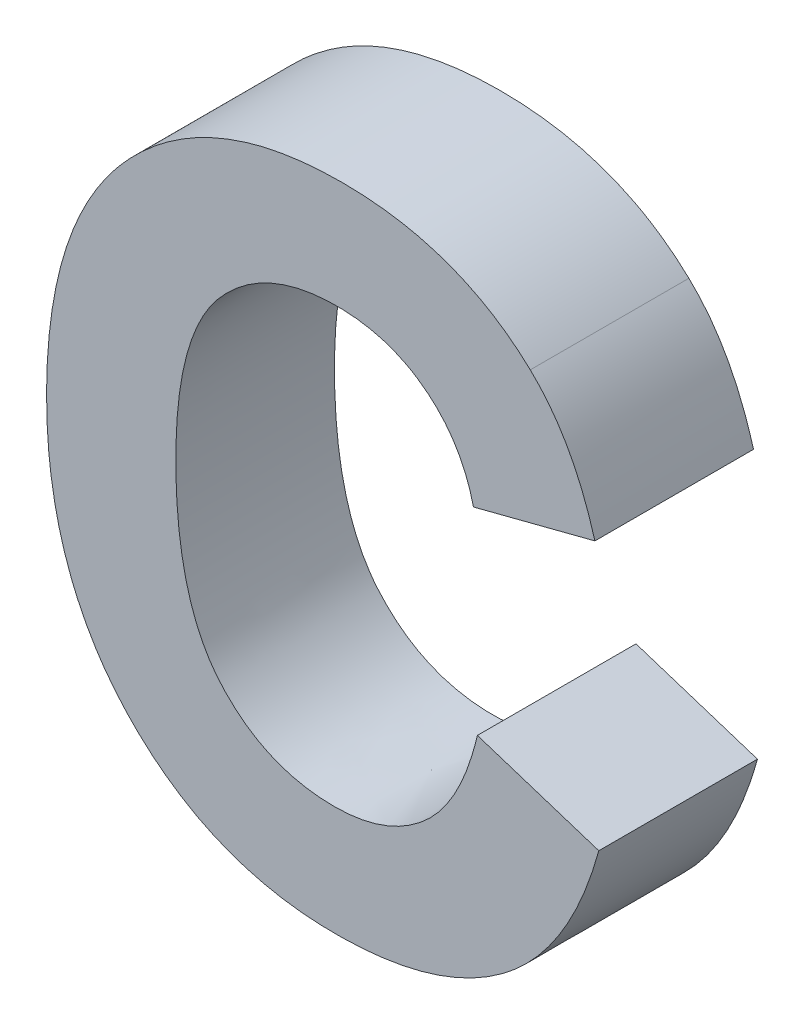
ISO-10303-21;
HEADER;
FILE_DESCRIPTION(('STEP AP214'),'2;1');
FILE_NAME('part.step','',(''),(''),'','','');
FILE_SCHEMA(('AUTOMOTIVE_DESIGN { 1 0 10303 214 1 1 1 1 }'));
ENDSEC;
DATA;
#1=APPLICATION_CONTEXT('core data for automotive mechanical design processes');
#2=APPLICATION_PROTOCOL_DEFINITION('international standard','automotive_design',2000,#1);
#3=PRODUCT_CONTEXT('',#1,'mechanical');
#4=PRODUCT('Part','Part','',(#3));
#5=PRODUCT_RELATED_PRODUCT_CATEGORY('part','',(#4));
#6=PRODUCT_DEFINITION_FORMATION('','',#4);
#7=PRODUCT_DEFINITION_CONTEXT('part definition',#1,'design');
#8=PRODUCT_DEFINITION('design','',#6,#7);
#9=PRODUCT_DEFINITION_SHAPE('','',#8);
#10=(LENGTH_UNIT() NAMED_UNIT(*) SI_UNIT(.MILLI.,.METRE.));
#11=(NAMED_UNIT(*) PLANE_ANGLE_UNIT() SI_UNIT($,.RADIAN.));
#12=(NAMED_UNIT(*) SI_UNIT($,.STERADIAN.) SOLID_ANGLE_UNIT());
#13=UNCERTAINTY_MEASURE_WITH_UNIT(LENGTH_MEASURE(1.E-05),#10,'distance_accuracy_value','');
#14=(GEOMETRIC_REPRESENTATION_CONTEXT(3) GLOBAL_UNCERTAINTY_ASSIGNED_CONTEXT((#13)) GLOBAL_UNIT_ASSIGNED_CONTEXT((#10,
#11,#12)) REPRESENTATION_CONTEXT('',''));
#15=CARTESIAN_POINT('',(0.,0.,0.));
#16=DIRECTION('',(0.,0.,1.));
#17=DIRECTION('',(1.,0.,0.));
#18=AXIS2_PLACEMENT_3D('',#15,#16,#17);
#19=CARTESIAN_POINT('',(-0.279592468961,-0.176557806708,0.674985954115));
#20=DIRECTION('',(0.249878019022072,-0.96827732370928,0.));
#21=DIRECTION('',(0.96827732370928,0.249878019022072,0.));
#22=AXIS2_PLACEMENT_3D('',#19,#20,#21);
#23=PLANE('',#22);
#24=DIRECTION('',(0.,0.,1.));
#25=VECTOR('',#24,1.);
#26=CARTESIAN_POINT('',(-0.356135678838,-0.196310893127,0.724985954115));
#27=LINE('',#26,#25);
#28=CARTESIAN_POINT('',(-0.356135678837973,-0.196310893127105,0.674985954115));
#29=VERTEX_POINT('',#28);
#30=CARTESIAN_POINT('',(-0.356135678837946,-0.19631089312721,0.774985954115));
#31=VERTEX_POINT('',#30);
#32=EDGE_CURVE('E72',#29,#31,#27,.T.);
#33=ORIENTED_EDGE('',*,*,#32,.F.);
#34=DIRECTION('',(-0.968277323710651,-0.249878019016757,0.));
#35=VECTOR('',#34,1.);
#36=CARTESIAN_POINT('',(-0.279592468961,-0.176557806708,0.674985954115));
#37=LINE('',#36,#35);
#38=CARTESIAN_POINT('',(-0.279592468961,-0.176557806708,0.674985954115));
#39=VERTEX_POINT('',#38);
#40=EDGE_CURVE('E117',#39,#29,#37,.T.);
#41=ORIENTED_EDGE('',*,*,#40,.F.);
#42=DIRECTION('',(0.,0.,-1.));
#43=VECTOR('',#42,1.);
#44=CARTESIAN_POINT('',(-0.279592468961,-0.176557806708,0.724985954115));
#45=LINE('',#44,#43);
#46=CARTESIAN_POINT('',(-0.279592468961,-0.176557806708,0.774985954115));
#47=VERTEX_POINT('',#46);
#48=EDGE_CURVE('E74',#47,#39,#45,.T.);
#49=ORIENTED_EDGE('',*,*,#48,.F.);
#50=DIRECTION('',(0.968277323710651,0.249878019016757,0.));
#51=VECTOR('',#50,1.);
#52=CARTESIAN_POINT('',(-0.356135678837892,-0.19631089312742,0.774985954115));
#53=LINE('',#52,#51);
#54=EDGE_CURVE('E69',#31,#47,#53,.T.);
#55=ORIENTED_EDGE('',*,*,#54,.F.);
#56=EDGE_LOOP('',(#33,#41,#49,#55));
#57=FACE_BOUND('',#56,.T.);
#58=ADVANCED_FACE('F16',(#57),#23,.T.);
#59=CARTESIAN_POINT('',(-0.356135678838,-0.196310893127,0.674985954115));
#60=CARTESIAN_POINT('',(-0.363350182067,-0.165408095923,0.674985954115));
#61=CARTESIAN_POINT('',(-0.38628613091,-0.147526161192,0.674985954115));
#62=CARTESIAN_POINT('',(-0.409222079753,-0.129644226461,0.674985954115));
#63=CARTESIAN_POINT('',(-0.442053881061,-0.129644226461,0.674985954115));
#64=CARTESIAN_POINT('',(-0.487347066213,-0.129644226461,0.674985954115));
#65=CARTESIAN_POINT('',(-0.515568533019,-0.161395764372,0.674985954115));
#66=CARTESIAN_POINT('',(-0.543789999826,-0.193147302284,0.674985954115));
#67=CARTESIAN_POINT('',(-0.543789999826,-0.264250689693,0.674985954115));
#68=CARTESIAN_POINT('',(-0.543789999826,-0.339675055336,0.674985954115));
#69=CARTESIAN_POINT('',(-0.516031503046,-0.371696677936,0.674985954115));
#70=CARTESIAN_POINT('',(-0.488273006267,-0.403718300535,0.674985954115));
#71=CARTESIAN_POINT('',(-0.443867142658,-0.403718300535,0.674985954115));
#72=CARTESIAN_POINT('',(-0.411112503021,-0.403718300535,0.674985954115));
#73=CARTESIAN_POINT('',(-0.387520679973,-0.383463663252,0.674985954115));
#74=CARTESIAN_POINT('',(-0.363928856925,-0.363209025969,0.674985954115));
#75=CARTESIAN_POINT('',(-0.353666543035,-0.319767683251,0.674985954115));
#76=CARTESIAN_POINT('',(-0.356135678838,-0.196310893127,0.774985954115));
#77=CARTESIAN_POINT('',(-0.363350182067,-0.165408095923,0.774985954115));
#78=CARTESIAN_POINT('',(-0.38628613091,-0.147526161192,0.774985954115));
#79=CARTESIAN_POINT('',(-0.409222079753,-0.129644226461,0.774985954115));
#80=CARTESIAN_POINT('',(-0.442053881061,-0.129644226461,0.774985954115));
#81=CARTESIAN_POINT('',(-0.487347066213,-0.129644226461,0.774985954115));
#82=CARTESIAN_POINT('',(-0.515568533019,-0.161395764372,0.774985954115));
#83=CARTESIAN_POINT('',(-0.543789999826,-0.193147302284,0.774985954115));
#84=CARTESIAN_POINT('',(-0.543789999826,-0.264250689693,0.774985954115));
#85=CARTESIAN_POINT('',(-0.543789999826,-0.339675055336,0.774985954115));
#86=CARTESIAN_POINT('',(-0.516031503046,-0.371696677936,0.774985954115));
#87=CARTESIAN_POINT('',(-0.488273006267,-0.403718300535,0.774985954115));
#88=CARTESIAN_POINT('',(-0.443867142658,-0.403718300535,0.774985954115));
#89=CARTESIAN_POINT('',(-0.411112503021,-0.403718300535,0.774985954115));
#90=CARTESIAN_POINT('',(-0.387520679973,-0.383463663252,0.774985954115));
#91=CARTESIAN_POINT('',(-0.363928856925,-0.363209025969,0.774985954115));
#92=CARTESIAN_POINT('',(-0.353666543035,-0.319767683251,0.774985954115));
#93=B_SPLINE_SURFACE_WITH_KNOTS('',1,2,((#59,#60,#61,#62,#63,#64,#65,#66,#67,#68,#69,#70,#71,
#72,#73,#74,#75),(#76,#77,#78,#79,#80,#81,#82,#83,#84,#85,#86,#87,#88,#89,#90,#91,#92)),
.UNSPECIFIED.,.F.,.F.,.F.,(2,2),(3,2,2,2,2,2,2,2,3),(0.,0.1),(10.,11.,12.,13.,14.,15.,16.,17.,
18.),.UNSPECIFIED.);
#94=DIRECTION('',(0.,0.,1.));
#95=VECTOR('',#94,1.);
#96=CARTESIAN_POINT('',(-0.353666543035089,-0.319767683251294,0.674985954115));
#97=LINE('',#96,#95);
#98=CARTESIAN_POINT('',(-0.353666543035077,-0.319767683251257,0.674985954115));
#99=VERTEX_POINT('',#98);
#100=CARTESIAN_POINT('',(-0.353666543035064,-0.319767683251231,0.774985954115));
#101=VERTEX_POINT('',#100);
#102=EDGE_CURVE('E63',#99,#101,#97,.T.);
#103=CARTESIAN_POINT('',(-0.356135678838,-0.196310893127,0.674985954115));
#104=CARTESIAN_POINT('',(-0.357254898276751,-0.191471279214673,0.674985954115));
#105=CARTESIAN_POINT('',(-0.358725057567637,-0.186692424737826,0.674985954115));
#106=CARTESIAN_POINT('',(-0.362415239886802,-0.177430163905322,0.674985954115));
#107=CARTESIAN_POINT('',(-0.364636164753612,-0.172947120663024,0.674985954115));
#108=CARTESIAN_POINT('',(-0.369891940513847,-0.164432888554072,0.674985954115));
#109=CARTESIAN_POINT('',(-0.37293244716624,-0.160405126492274,0.674985954115));
#110=CARTESIAN_POINT('',(-0.379715444084064,-0.153004414297028,0.674985954115));
#111=CARTESIAN_POINT('',(-0.383457175709156,-0.14963076444458,0.674985954115));
#112=CARTESIAN_POINT('',(-0.391093828283532,-0.14390113910682,0.674985954115));
#113=CARTESIAN_POINT('',(-0.394938798352544,-0.141478239241465,0.674985954115));
#114=CARTESIAN_POINT('',(-0.40298291008326,-0.137312583423097,0.674985954115));
#115=CARTESIAN_POINT('',(-0.407182201747628,-0.135570117307623,0.674985954115));
#116=CARTESIAN_POINT('',(-0.420211292421096,-0.131368862730361,0.674985954115));
#117=CARTESIAN_POINT('',(-0.429394433527774,-0.129992887374619,0.674985954115));
#118=CARTESIAN_POINT('',(-0.444004551546948,-0.129519128144211,0.674985954115));
#119=CARTESIAN_POINT('',(-0.449443958805419,-0.129723566814483,0.674985954115));
#120=CARTESIAN_POINT('',(-0.46024039037994,-0.13090264238193,0.674985954115));
#121=CARTESIAN_POINT('',(-0.465597590730882,-0.1318752951527,0.674985954115));
#122=CARTESIAN_POINT('',(-0.475727008296407,-0.134635542896864,0.674985954115));
#123=CARTESIAN_POINT('',(-0.480514601271476,-0.136365939843074,0.674985954115));
#124=CARTESIAN_POINT('',(-0.489732085859811,-0.140625397825991,0.674985954115));
#125=CARTESIAN_POINT('',(-0.494161463743507,-0.14315558122331,0.674985954115));
#126=CARTESIAN_POINT('',(-0.5025120630443,-0.148929267115542,0.674985954115));
#127=CARTESIAN_POINT('',(-0.506433828456352,-0.152171995766589,0.674985954115));
#128=CARTESIAN_POINT('',(-0.51374827124536,-0.159201588298196,0.674985954115));
#129=CARTESIAN_POINT('',(-0.51714193239622,-0.162987414552926,0.674985954115));
#130=CARTESIAN_POINT('',(-0.523207159952747,-0.171201370420922,0.674985954115));
#131=CARTESIAN_POINT('',(-0.525865533156709,-0.175639286310684,0.674985954115));
#132=CARTESIAN_POINT('',(-0.530487742278049,-0.18485656665,0.674985954115));
#133=CARTESIAN_POINT('',(-0.532450403669968,-0.189636492300314,0.674985954115));
#134=CARTESIAN_POINT('',(-0.537206431666388,-0.203468685762284,0.674985954115));
#135=CARTESIAN_POINT('',(-0.539321293652506,-0.21275002061556,0.674985954115));
#136=CARTESIAN_POINT('',(-0.542279741487001,-0.231520907165955,0.674985954115));
#137=CARTESIAN_POINT('',(-0.543116997845585,-0.241011260755679,0.674985954115));
#138=CARTESIAN_POINT('',(-0.543769698552632,-0.256730545311967,0.674985954115));
#139=CARTESIAN_POINT('',(-0.543838605739656,-0.262950667209052,0.674985954115));
#140=CARTESIAN_POINT('',(-0.543681427759854,-0.275372661436556,0.674985954115));
#141=CARTESIAN_POINT('',(-0.543455851754544,-0.281574546733212,0.674985954115));
#142=CARTESIAN_POINT('',(-0.542230833765744,-0.300133154977906,0.674985954115));
#143=CARTESIAN_POINT('',(-0.540684999220511,-0.312479208742507,0.674985954115));
#144=CARTESIAN_POINT('',(-0.536590495498945,-0.330193115065238,0.674985954115));
#145=CARTESIAN_POINT('',(-0.535012176459414,-0.335780690004739,0.674985954115));
#146=CARTESIAN_POINT('',(-0.531125837126381,-0.346689998171476,0.674985954115));
#147=CARTESIAN_POINT('',(-0.528820513672192,-0.352012631044506,0.674985954115));
#148=CARTESIAN_POINT('',(-0.524654122837149,-0.359671135866866,0.674985954115));
#149=CARTESIAN_POINT('',(-0.523130666664466,-0.362190357159392,0.674985954115));
#150=CARTESIAN_POINT('',(-0.519810727509482,-0.367043915573096,0.674985954115));
#151=CARTESIAN_POINT('',(-0.518014222695948,-0.369378237888206,0.674985954115));
#152=CARTESIAN_POINT('',(-0.514189189149632,-0.373852952591659,0.674985954115));
#153=CARTESIAN_POINT('',(-0.512160236660961,-0.375992977627026,0.674985954115));
#154=CARTESIAN_POINT('',(-0.507928438165652,-0.380093524203073,0.674985954115));
#155=CARTESIAN_POINT('',(-0.505725541889525,-0.382053993496248,0.674985954115));
#156=CARTESIAN_POINT('',(-0.499507457050159,-0.387060048853082,0.674985954115));
#157=CARTESIAN_POINT('',(-0.495313765367074,-0.389890709898948,0.674985954115));
#158=CARTESIAN_POINT('',(-0.486511127717486,-0.394766888744274,0.674985954115));
#159=CARTESIAN_POINT('',(-0.481903353486988,-0.396814540895407,0.674985954115));
#160=CARTESIAN_POINT('',(-0.467906648381052,-0.401631929374826,0.674985954115));
#161=CARTESIAN_POINT('',(-0.458115264036434,-0.403254723852777,0.674985954115));
#162=CARTESIAN_POINT('',(-0.442712124872334,-0.403854707909706,0.674985954115));
#163=CARTESIAN_POINT('',(-0.43709678171171,-0.403664436807128,0.674985954115));
#164=CARTESIAN_POINT('',(-0.425987600361934,-0.402257436864805,0.674985954115));
#165=CARTESIAN_POINT('',(-0.420493443918073,-0.401043839328515,0.674985954115));
#166=CARTESIAN_POINT('',(-0.410148999511382,-0.397590757695516,0.674985954115));
#167=CARTESIAN_POINT('',(-0.40528018651639,-0.395406453048082,0.674985954115));
#168=CARTESIAN_POINT('',(-0.396057291610866,-0.390147084646268,0.674985954115));
#169=CARTESIAN_POINT('',(-0.391702664894627,-0.387072975826246,0.674985954115));
#170=CARTESIAN_POINT('',(-0.384177514482931,-0.380576231067895,0.674985954115));
#171=CARTESIAN_POINT('',(-0.380926950212821,-0.377246028497902,0.674985954115));
#172=CARTESIAN_POINT('',(-0.375020903721375,-0.370073862071774,0.674985954115));
#173=CARTESIAN_POINT('',(-0.372368230412683,-0.36622961246141,0.674985954115));
#174=CARTESIAN_POINT('',(-0.366046066537239,-0.355654027409895,0.674985954115));
#175=CARTESIAN_POINT('',(-0.362827572894062,-0.348662641734766,0.674985954115));
#176=CARTESIAN_POINT('',(-0.357517061054969,-0.334368249442551,0.674985954115));
#177=CARTESIAN_POINT('',(-0.35540941254209,-0.327071217886631,0.674985954115));
#178=CARTESIAN_POINT('',(-0.353666543035044,-0.319767683251186,0.674985954115));
#179=B_SPLINE_CURVE_WITH_KNOTS('',3,(#103,#104,#105,#106,#107,#108,#109,#110,#111,#112,#113,
#114,#115,#116,#117,#118,#119,#120,#121,#122,#123,#124,#125,#126,#127,#128,#129,#130,#131,#132,
#133,#134,#135,#136,#137,#138,#139,#140,#141,#142,#143,#144,#145,#146,#147,#148,#149,#150,#151,
#152,#153,#154,#155,#156,#157,#158,#159,#160,#161,#162,#163,#164,#165,#166,#167,#168,#169,#170,
#171,#172,#173,#174,#175,#176,#177,#178),.UNSPECIFIED.,.F.,.F.,(4,2,2,2,2,2,2,2,2,2,2,2,2,2,2,2,
2,2,2,2,2,2,2,2,2,2,2,2,2,2,2,2,2,2,2,2,2,4),(0.,0.0149206646742262,0.0298593164951498,
0.0449038196867246,0.0599321395422058,0.0735046698045396,0.0870829751315109,0.114514022615726,
0.130816521256441,0.147077051311877,0.1622786206077,0.17750161807314,0.192708163941761,
0.20788603429868,0.223320783126359,0.238781466716405,0.267175340249795,0.295709430635991,
0.314361118719795,0.332980600701813,0.370110536847196,0.387496690599096,0.404819093984741,
0.413636470952752,0.422454553273373,0.431288974876846,0.44012595902542,0.455222009637713,
0.470276612517699,0.49956119493081,0.516370316097714,0.533128188462795,0.549035744499413,
0.564926291508314,0.578818672948653,0.592775020542864,0.615752133707008,0.638396676689807),.UNSPECIFIED.);
#180=EDGE_CURVE('E84',#29,#99,#179,.T.);
#181=CARTESIAN_POINT('',(-0.35366654303504,-0.319767683251168,0.774985954115));
#182=CARTESIAN_POINT('',(-0.355687040436747,-0.328199750439674,0.774985954115));
#183=CARTESIAN_POINT('',(-0.358200874651319,-0.336684800105453,0.774985954115));
#184=CARTESIAN_POINT('',(-0.364766990785648,-0.353132982648727,0.774985954115));
#185=CARTESIAN_POINT('',(-0.368837778609231,-0.361088430392867,0.774985954115));
#186=CARTESIAN_POINT('',(-0.376616121766145,-0.37215109925378,0.774985954115));
#187=CARTESIAN_POINT('',(-0.379574244491861,-0.375763571678784,0.774985954115));
#188=CARTESIAN_POINT('',(-0.386079705061797,-0.382377408443172,0.774985954115));
#189=CARTESIAN_POINT('',(-0.389624173101807,-0.385381598047371,0.774985954115));
#190=CARTESIAN_POINT('',(-0.397158554117818,-0.390795206037561,0.774985954115));
#191=CARTESIAN_POINT('',(-0.401149995252499,-0.393202487584971,0.774985954115));
#192=CARTESIAN_POINT('',(-0.409493153450893,-0.39727978777421,0.774985954115));
#193=CARTESIAN_POINT('',(-0.413844647752918,-0.398950258283463,0.774985954115));
#194=CARTESIAN_POINT('',(-0.42268223879686,-0.401512302438191,0.774985954115));
#195=CARTESIAN_POINT('',(-0.427164460989425,-0.402417457946247,0.774985954115));
#196=CARTESIAN_POINT('',(-0.436218745755132,-0.403541932384129,0.774985954115));
#197=CARTESIAN_POINT('',(-0.440791008869727,-0.403759490416759,0.774985954115));
#198=CARTESIAN_POINT('',(-0.450569075626467,-0.403651854183943,0.774985954115));
#199=CARTESIAN_POINT('',(-0.455773908478006,-0.403246363709855,0.774985954115));
#200=CARTESIAN_POINT('',(-0.466054322504363,-0.401643916530467,0.774985954115));
#201=CARTESIAN_POINT('',(-0.471130195151212,-0.400448947738898,0.774985954115));
#202=CARTESIAN_POINT('',(-0.481529874290254,-0.397009771259514,0.774985954115));
#203=CARTESIAN_POINT('',(-0.486821743876363,-0.394666643913979,0.774985954115));
#204=CARTESIAN_POINT('',(-0.49684061119748,-0.388958435146803,0.774985954115));
#205=CARTESIAN_POINT('',(-0.501566281809796,-0.38559101575731,0.774985954115));
#206=CARTESIAN_POINT('',(-0.50779721179586,-0.380201784591472,0.774985954115));
#207=CARTESIAN_POINT('',(-0.509600390835434,-0.378509746116868,0.774985954115));
#208=CARTESIAN_POINT('',(-0.513085293373342,-0.375005171309869,0.774985954115));
#209=CARTESIAN_POINT('',(-0.514767083756838,-0.373192702408539,0.774985954115));
#210=CARTESIAN_POINT('',(-0.517958964537656,-0.369430412904652,0.774985954115));
#211=CARTESIAN_POINT('',(-0.519469565292573,-0.367481030216366,0.774985954115));
#212=CARTESIAN_POINT('',(-0.522299707724115,-0.363449297183293,0.774985954115));
#213=CARTESIAN_POINT('',(-0.523619255127474,-0.361366950826726,0.774985954115));
#214=CARTESIAN_POINT('',(-0.528151227049608,-0.353538186611536,0.774985954115));
#215=CARTESIAN_POINT('',(-0.53083963067476,-0.347486822982404,0.774985954115));
#216=CARTESIAN_POINT('',(-0.535277960323164,-0.335041215436559,0.774985954115));
#217=CARTESIAN_POINT('',(-0.537022759725635,-0.328645302035261,0.774985954115));
#218=CARTESIAN_POINT('',(-0.541370305907999,-0.30859891531844,0.774985954115));
#219=CARTESIAN_POINT('',(-0.542806964418152,-0.2947043329706,0.774985954115));
#220=CARTESIAN_POINT('',(-0.543745014027216,-0.273869783907693,0.774985954115));
#221=CARTESIAN_POINT('',(-0.543854783216962,-0.266924889670208,0.774985954115));
#222=CARTESIAN_POINT('',(-0.543673450012528,-0.253035314734142,0.774985954115));
#223=CARTESIAN_POINT('',(-0.543382396826471,-0.246090634114001,0.774985954115));
#224=CARTESIAN_POINT('',(-0.542239200413989,-0.232163167807338,0.774985954115));
#225=CARTESIAN_POINT('',(-0.541380979870505,-0.225180791059781,0.774985954115));
#226=CARTESIAN_POINT('',(-0.538927015176118,-0.211373136286481,0.774985954115));
#227=CARTESIAN_POINT('',(-0.537332824070926,-0.204547559066164,0.774985954115));
#228=CARTESIAN_POINT('',(-0.531875167395338,-0.187210531711712,0.774985954115));
#229=CARTESIAN_POINT('',(-0.527230318175736,-0.176872711513791,0.774985954115));
#230=CARTESIAN_POINT('',(-0.517454478330901,-0.163316961312964,0.774985954115));
#231=CARTESIAN_POINT('',(-0.513700678996205,-0.159106759532181,0.774985954115));
#232=CARTESIAN_POINT('',(-0.505543972709528,-0.151369121620122,0.774985954115));
#233=CARTESIAN_POINT('',(-0.501140289480481,-0.147842513850864,0.774985954115));
#234=CARTESIAN_POINT('',(-0.492140487145592,-0.141954220951715,0.774985954115));
#235=CARTESIAN_POINT('',(-0.487593411912842,-0.139518479539322,0.774985954115));
#236=CARTESIAN_POINT('',(-0.478151687979412,-0.135467906848971,0.774985954115));
#237=CARTESIAN_POINT('',(-0.47325712548161,-0.133852872779495,0.774985954115));
#238=CARTESIAN_POINT('',(-0.462182238902395,-0.131160454309395,0.774985954115));
#239=CARTESIAN_POINT('',(-0.45595572689875,-0.130279207736691,0.774985954115));
#240=CARTESIAN_POINT('',(-0.443434313604232,-0.129476024771642,0.774985954115));
#241=CARTESIAN_POINT('',(-0.43713930340289,-0.129555945568386,0.774985954115));
#242=CARTESIAN_POINT('',(-0.425989217703503,-0.130686227105677,0.774985954115));
#243=CARTESIAN_POINT('',(-0.421114286741484,-0.131525250221189,0.774985954115));
#244=CARTESIAN_POINT('',(-0.411581332445359,-0.134005620675344,0.774985954115));
#245=CARTESIAN_POINT('',(-0.406922677393809,-0.135644446111112,0.774985954115));
#246=CARTESIAN_POINT('',(-0.397954711510737,-0.13975593084618,0.774985954115));
#247=CARTESIAN_POINT('',(-0.393647654667975,-0.142233514479552,0.774985954115));
#248=CARTESIAN_POINT('',(-0.385540525806112,-0.147918975160506,0.774985954115));
#249=CARTESIAN_POINT('',(-0.381740902134051,-0.1511274913464,0.774985954115));
#250=CARTESIAN_POINT('',(-0.375045749149475,-0.157935666936957,0.774985954115));
#251=CARTESIAN_POINT('',(-0.372104894475395,-0.161490703112017,0.774985954115));
#252=CARTESIAN_POINT('',(-0.366884085226702,-0.169057123268984,0.774985954115));
#253=CARTESIAN_POINT('',(-0.364604220196703,-0.173068568978531,0.774985954115));
#254=CARTESIAN_POINT('',(-0.361227934951745,-0.180285636245997,0.774985954115));
#255=CARTESIAN_POINT('',(-0.35997803158493,-0.183421816639875,0.774985954115));
#256=CARTESIAN_POINT('',(-0.357813859030226,-0.189798409539599,0.774985954115));
#257=CARTESIAN_POINT('',(-0.356898619302585,-0.1930384905199,0.774985954115));
#258=CARTESIAN_POINT('',(-0.356135678838,-0.196310893127,0.774985954115));
#259=B_SPLINE_CURVE_WITH_KNOTS('',3,(#181,#182,#183,#184,#185,#186,#187,#188,#189,#190,#191,
#192,#193,#194,#195,#196,#197,#198,#199,#200,#201,#202,#203,#204,#205,#206,#207,#208,#209,#210,
#211,#212,#213,#214,#215,#216,#217,#218,#219,#220,#221,#222,#223,#224,#225,#226,#227,#228,#229,
#230,#231,#232,#233,#234,#235,#236,#237,#238,#239,#240,#241,#242,#243,#244,#245,#246,#247,#248,
#249,#250,#251,#252,#253,#254,#255,#256,#257,#258),.UNSPECIFIED.,.F.,.F.,(4,2,2,2,2,2,2,2,2,2,2,
2,2,2,2,2,2,2,2,2,2,2,2,2,2,2,2,2,2,2,2,2,2,2,2,2,2,2,4),(0.,0.0262746865434792,
0.0528718989883163,0.0668089257686969,0.0806796548263389,0.0945993444337243,0.108510485540685,
0.122169232883613,0.135862931259724,0.151474807850181,0.167047522655913,0.184293043311891,
0.20157822642472,0.208992197926363,0.216402052640434,0.22378920091299,0.231176127713399,
0.250914013193877,0.270758084357543,0.312421464361037,0.333260753194554,0.354097483860207,
0.375161185234757,0.396180639723391,0.429466994439555,0.446286772494726,0.463126806636015,
0.47851993248452,0.493909252938706,0.512680366903608,0.531487756652649,0.546270300891987,
0.561006531685769,0.57583082383449,0.590668128661382,0.604440141553868,0.618214019277352,
0.62832449628769,0.638405415442628),.UNSPECIFIED.);
#260=EDGE_CURVE('E23',#101,#31,#259,.T.);
#261=ORIENTED_EDGE('',*,*,#102,.F.);
#262=ORIENTED_EDGE('',*,*,#180,.F.);
#263=ORIENTED_EDGE('',*,*,#32,.T.);
#264=ORIENTED_EDGE('',*,*,#260,.F.);
#265=EDGE_LOOP('',(#261,#262,#263,#264));
#266=FACE_BOUND('',#265,.T.);
#267=ADVANCED_FACE('F81',(#266),#93,.T.);
#268=CARTESIAN_POINT('',(-0.354431975134,-0.319520769671,0.674985954115));
#269=DIRECTION('',(0.307002779922846,0.951708617760523,0.));
#270=DIRECTION('',(-0.951708617760523,0.307002779922846,0.));
#271=AXIS2_PLACEMENT_3D('',#268,#269,#270);
#272=PLANE('',#271);
#273=DIRECTION('',(0.,0.,1.));
#274=VECTOR('',#273,1.);
#275=CARTESIAN_POINT('',(-0.277123333159,-0.344459041275,0.724985954115));
#276=LINE('',#275,#274);
#277=CARTESIAN_POINT('',(-0.277123333159062,-0.344459041275192,0.674985954115));
#278=VERTEX_POINT('',#277);
#279=CARTESIAN_POINT('',(-0.277123333159,-0.344459041275,0.774985954115));
#280=VERTEX_POINT('',#279);
#281=EDGE_CURVE('E126',#278,#280,#276,.T.);
#282=ORIENTED_EDGE('',*,*,#281,.F.);
#283=DIRECTION('',(0.951708617761765,-0.307002779918994,0.));
#284=VECTOR('',#283,1.);
#285=CARTESIAN_POINT('',(-0.353666543035065,-0.319767683251221,0.674985954115));
#286=LINE('',#285,#284);
#287=EDGE_CURVE('E118',#99,#278,#286,.T.);
#288=ORIENTED_EDGE('',*,*,#287,.F.);
#289=ORIENTED_EDGE('',*,*,#102,.T.);
#290=DIRECTION('',(-0.951708617763157,0.307002779914678,0.));
#291=VECTOR('',#290,1.);
#292=CARTESIAN_POINT('',(-0.277123333159,-0.344459041275,0.774985954115));
#293=LINE('',#292,#291);
#294=EDGE_CURVE('E78',#280,#101,#293,.T.);
#295=ORIENTED_EDGE('',*,*,#294,.F.);
#296=EDGE_LOOP('',(#282,#288,#289,#295));
#297=FACE_BOUND('',#296,.T.);
#298=ADVANCED_FACE('F136',(#297),#272,.T.);
#299=CARTESIAN_POINT('',(-0.202262487934,-0.121819494413,0.774985954115));
#300=DIRECTION('',(0.,0.,1.));
#301=DIRECTION('',(1.,0.,0.));
#302=AXIS2_PLACEMENT_3D('',#299,#300,#301);
#303=PLANE('',#302);
#304=ORIENTED_EDGE('',*,*,#294,.T.);
#305=ORIENTED_EDGE('',*,*,#260,.T.);
#306=ORIENTED_EDGE('',*,*,#54,.T.);
#307=CARTESIAN_POINT('',(-0.279592468961,-0.176557806708,0.774985954115));
#308=CARTESIAN_POINT('',(-0.293172697037,-0.12894977142,0.774985954115));
#309=CARTESIAN_POINT('',(-0.320333190864,-0.103525377518,0.774985954115));
#310=B_SPLINE_CURVE_WITH_KNOTS('',2,(#307,#308,#309),.UNSPECIFIED.,.F.,.F.,(3,3),(0.,1.),.UNSPECIFIED.);
#311=CARTESIAN_POINT('',(-0.320333190864,-0.103525377518,0.774985954115));
#312=VERTEX_POINT('',#311);
#313=EDGE_CURVE('E89',#312,#47,#310,.F.);
#314=ORIENTED_EDGE('',*,*,#313,.F.);
#315=CARTESIAN_POINT('',(-0.277123333159,-0.344459041275,0.774985954115));
#316=CARTESIAN_POINT('',(-0.280494707885067,-0.356725715919525,0.774985954115));
#317=CARTESIAN_POINT('',(-0.284751073305697,-0.368927162038958,0.774985954115));
#318=CARTESIAN_POINT('',(-0.295497592112542,-0.392430256885313,0.774985954115));
#319=CARTESIAN_POINT('',(-0.302010422734197,-0.403721278418277,0.774985954115));
#320=CARTESIAN_POINT('',(-0.31469387496872,-0.420411804945291,0.774985954115));
#321=CARTESIAN_POINT('',(-0.320048296062486,-0.426416272654394,0.774985954115));
#322=CARTESIAN_POINT('',(-0.331701611269677,-0.437351726764251,0.774985954115));
#323=CARTESIAN_POINT('',(-0.337994707922732,-0.442288876161703,0.774985954115));
#324=CARTESIAN_POINT('',(-0.351317697264666,-0.451027224017799,0.774985954115));
#325=CARTESIAN_POINT('',(-0.358347358386547,-0.454828778055151,0.774985954115));
#326=CARTESIAN_POINT('',(-0.372938288994301,-0.46127808530844,0.774985954115));
#327=CARTESIAN_POINT('',(-0.380501314524053,-0.463921798821921,0.774985954115));
#328=CARTESIAN_POINT('',(-0.399317106070656,-0.469051958886726,0.774985954115));
#329=CARTESIAN_POINT('',(-0.410727928398352,-0.470956357443545,0.774985954115));
#330=CARTESIAN_POINT('',(-0.427945448447278,-0.472467220451772,0.774985954115));
#331=CARTESIAN_POINT('',(-0.433712253232243,-0.472745814491475,0.774985954115));
#332=CARTESIAN_POINT('',(-0.445251334418807,-0.472909861146335,0.774985954115));
#333=CARTESIAN_POINT('',(-0.451023609537456,-0.472795390245449,0.774985954115));
#334=CARTESIAN_POINT('',(-0.468726954657546,-0.471717907176676,0.774985954115));
#335=CARTESIAN_POINT('',(-0.480627696779113,-0.469976889391478,0.774985954115));
#336=CARTESIAN_POINT('',(-0.503785007624403,-0.464121093113974,0.774985954115));
#337=CARTESIAN_POINT('',(-0.515044750548467,-0.460019382166814,0.774985954115));
#338=CARTESIAN_POINT('',(-0.534771193700241,-0.450230816737601,0.774985954115));
#339=CARTESIAN_POINT('',(-0.54340333138622,-0.444874859026256,0.774985954115));
#340=CARTESIAN_POINT('',(-0.559603646681889,-0.432708412757193,0.774985954115));
#341=CARTESIAN_POINT('',(-0.567168447595178,-0.425893472392542,0.774985954115));
#342=CARTESIAN_POINT('',(-0.580717487839327,-0.411448835069773,0.774985954115));
#343=CARTESIAN_POINT('',(-0.586760271674278,-0.403874132083096,0.774985954115));
#344=CARTESIAN_POINT('',(-0.597438988172557,-0.387826979925721,0.774985954115));
#345=CARTESIAN_POINT('',(-0.602079527530039,-0.379357596535575,0.774985954115));
#346=CARTESIAN_POINT('',(-0.610951516186211,-0.359656439011325,0.774985954115));
#347=CARTESIAN_POINT('',(-0.614804304825129,-0.348256194530784,0.774985954115));
#348=CARTESIAN_POINT('',(-0.620639555809385,-0.324925771231679,0.774985954115));
#349=CARTESIAN_POINT('',(-0.622608716133748,-0.312992437454221,0.774985954115));
#350=CARTESIAN_POINT('',(-0.624695681909804,-0.291938620794572,0.774985954115));
#351=CARTESIAN_POINT('',(-0.625149277962711,-0.282846686699816,0.774985954115));
#352=CARTESIAN_POINT('',(-0.625357632929293,-0.264646301526312,0.774985954115));
#353=CARTESIAN_POINT('',(-0.625111646941061,-0.255537843169788,0.774985954115));
#354=CARTESIAN_POINT('',(-0.623886162962654,-0.237398215246287,0.774985954115));
#355=CARTESIAN_POINT('',(-0.622909188840416,-0.228366887638045,0.774985954115));
#356=CARTESIAN_POINT('',(-0.620056858515758,-0.210456621019353,0.774985954115));
#357=CARTESIAN_POINT('',(-0.618182953516549,-0.201577459762169,0.774985954115));
#358=CARTESIAN_POINT('',(-0.613055566112997,-0.182896737251645,0.774985954115));
#359=CARTESIAN_POINT('',(-0.609648009086843,-0.173135886387634,0.774985954115));
#360=CARTESIAN_POINT('',(-0.601302016208827,-0.154298340176815,0.774985954115));
#361=CARTESIAN_POINT('',(-0.596366857324844,-0.145220231556635,0.774985954115));
#362=CARTESIAN_POINT('',(-0.584872573520612,-0.128070458661943,0.774985954115));
#363=CARTESIAN_POINT('',(-0.578303236991556,-0.120005622124593,0.774985954115));
#364=CARTESIAN_POINT('',(-0.563847275272361,-0.105146974104685,0.774985954115));
#365=CARTESIAN_POINT('',(-0.555959618328239,-0.0983541670463116,0.774985954115));
#366=CARTESIAN_POINT('',(-0.539658669616482,-0.0868027669911389,0.774985954115));
#367=CARTESIAN_POINT('',(-0.531325117907391,-0.0819322901587901,0.774985954115));
#368=CARTESIAN_POINT('',(-0.51394384860286,-0.0737332481660763,0.774985954115));
#369=CARTESIAN_POINT('',(-0.504896544140578,-0.0704037985846415,0.774985954115));
#370=CARTESIAN_POINT('',(-0.484318115100097,-0.0646562278840809,0.774985954115));
#371=CARTESIAN_POINT('',(-0.472684201519101,-0.0626087343986875,0.774985954115));
#372=CARTESIAN_POINT('',(-0.455106745188802,-0.060960333926123,0.774985954115));
#373=CARTESIAN_POINT('',(-0.449212823984067,-0.0606489401643452,0.774985954115));
#374=CARTESIAN_POINT('',(-0.437417809651245,-0.0604418050860988,0.774985954115));
#375=CARTESIAN_POINT('',(-0.431516717692902,-0.0605460032308079,0.774985954115));
#376=CARTESIAN_POINT('',(-0.415685295303316,-0.0614489407829983,0.774985954115));
#377=CARTESIAN_POINT('',(-0.405772719345691,-0.0626757475354922,0.774985954115));
#378=CARTESIAN_POINT('',(-0.38633530590315,-0.0667283347514654,0.774985954115));
#379=CARTESIAN_POINT('',(-0.376808280028206,-0.0695431206796614,0.774985954115));
#380=CARTESIAN_POINT('',(-0.358966614453504,-0.0767299993406061,0.774985954115));
#381=CARTESIAN_POINT('',(-0.35061388943598,-0.0810051442941454,0.774985954115));
#382=CARTESIAN_POINT('',(-0.338745122476093,-0.0885763177089831,0.774985954115));
#383=CARTESIAN_POINT('',(-0.334868704312134,-0.0913217172172437,0.774985954115));
#384=CARTESIAN_POINT('',(-0.327389341229137,-0.0971663317110543,0.774985954115));
#385=CARTESIAN_POINT('',(-0.323786523879539,-0.100265710077217,0.774985954115));
#386=CARTESIAN_POINT('',(-0.320333190866832,-0.103525377515328,0.774985954115));
#387=B_SPLINE_CURVE_WITH_KNOTS('',3,(#315,#316,#317,#318,#319,#320,#321,#322,#323,#324,#325,
#326,#327,#328,#329,#330,#331,#332,#333,#334,#335,#336,#337,#338,#339,#340,#341,#342,#343,#344,
#345,#346,#347,#348,#349,#350,#351,#352,#353,#354,#355,#356,#357,#358,#359,#360,#361,#362,#363,
#364,#365,#366,#367,#368,#369,#370,#371,#372,#373,#374,#375,#376,#377,#378,#379,#380,#381,#382,
#383,#384,#385,#386),.UNSPECIFIED.,.F.,.F.,(4,2,2,2,2,2,2,2,2,2,2,2,2,2,2,2,2,2,2,2,2,2,2,2,2,2,
2,2,2,2,2,2,2,2,2,4),(0.,0.0384160088106247,0.0772298647044894,0.101245790328594,
0.125119100249322,0.148984927081804,0.172933370949486,0.207429033942596,0.224740963707624,
0.24204952504746,0.27791049676902,0.313574844663941,0.343878946389237,0.374276867853396,
0.403211883104799,0.432050780029121,0.467953972850712,0.504108878906521,0.531389195671233,
0.558698570880234,0.585914088173486,0.613085719786341,0.643987519205243,0.67482348306959,
0.705857199566024,0.736915318622107,0.765718524859535,0.794505179899398,0.829733234037272,
0.847428661422267,0.865121511227693,0.894972422780999,0.924619151176369,0.952591243419361,
0.966822793094076,0.981060938157767),.UNSPECIFIED.);
#388=EDGE_CURVE('E101',#280,#312,#387,.T.);
#389=ORIENTED_EDGE('',*,*,#388,.F.);
#390=EDGE_LOOP('',(#304,#305,#306,#314,#389));
#391=FACE_BOUND('',#390,.T.);
#392=ADVANCED_FACE('F87',(#391),#303,.T.);
#393=CARTESIAN_POINT('',(-0.320333190864,-0.103525377518,0.674985954115));
#394=CARTESIAN_POINT('',(-0.293172697037,-0.12894977142,0.674985954115));
#395=CARTESIAN_POINT('',(-0.279592468961,-0.176557806708,0.674985954115));
#396=CARTESIAN_POINT('',(-0.320333190864,-0.103525377518,0.774985954115));
#397=CARTESIAN_POINT('',(-0.293172697037,-0.12894977142,0.774985954115));
#398=CARTESIAN_POINT('',(-0.279592468961,-0.176557806708,0.774985954115));
#399=B_SPLINE_SURFACE_WITH_KNOTS('',1,2,((#393,#394,#395),(#396,#397,#398)),.UNSPECIFIED.,.F.,
.F.,.F.,(2,2),(3,3),(0.,0.1),(8.,9.),.UNSPECIFIED.);
#400=CARTESIAN_POINT('',(-0.320333190864,-0.103525377518,0.674985954115));
#401=CARTESIAN_POINT('',(-0.293172697037,-0.12894977142,0.674985954115));
#402=CARTESIAN_POINT('',(-0.279592468961,-0.176557806708,0.674985954115));
#403=B_SPLINE_CURVE_WITH_KNOTS('',2,(#400,#401,#402),.UNSPECIFIED.,.F.,.F.,(3,3),(0.,1.),.UNSPECIFIED.);
#404=CARTESIAN_POINT('',(-0.320333190864,-0.103525377518,0.674985954115));
#405=VERTEX_POINT('',#404);
#406=EDGE_CURVE('E43',#405,#39,#403,.T.);
#407=DIRECTION('',(0.,0.,-1.));
#408=VECTOR('',#407,1.);
#409=CARTESIAN_POINT('',(-0.320333190864,-0.103525377518,0.724985954115));
#410=LINE('',#409,#408);
#411=EDGE_CURVE('E34',#312,#405,#410,.T.);
#412=ORIENTED_EDGE('',*,*,#406,.F.);
#413=ORIENTED_EDGE('',*,*,#411,.F.);
#414=ORIENTED_EDGE('',*,*,#313,.T.);
#415=ORIENTED_EDGE('',*,*,#48,.T.);
#416=EDGE_LOOP('',(#412,#413,#414,#415));
#417=FACE_BOUND('',#416,.T.);
#418=ADVANCED_FACE('F108',(#417),#399,.T.);
#419=CARTESIAN_POINT('',(-0.202262487934,-0.121819494413,0.674985954115));
#420=DIRECTION('',(0.,0.,-1.));
#421=DIRECTION('',(-1.,0.,0.));
#422=AXIS2_PLACEMENT_3D('',#419,#420,#421);
#423=PLANE('',#422);
#424=ORIENTED_EDGE('',*,*,#180,.T.);
#425=ORIENTED_EDGE('',*,*,#287,.T.);
#426=CARTESIAN_POINT('',(-0.320333190864,-0.103525377518,0.674985954115));
#427=CARTESIAN_POINT('',(-0.32653240006357,-0.0976358601645974,0.674985954115));
#428=CARTESIAN_POINT('',(-0.333249569290072,-0.0923000005181309,0.674985954115));
#429=CARTESIAN_POINT('',(-0.347401707515702,-0.0829038837801938,0.674985954115));
#430=CARTESIAN_POINT('',(-0.35482650200591,-0.0788283191988911,0.674985954115));
#431=CARTESIAN_POINT('',(-0.370239237450184,-0.0719688922224524,0.674985954115));
#432=CARTESIAN_POINT('',(-0.378226793993076,-0.0691841577558636,0.674985954115));
#433=CARTESIAN_POINT('',(-0.394557527074158,-0.0648092476440676,0.674985954115));
#434=CARTESIAN_POINT('',(-0.402902310338376,-0.0632252403399179,0.674985954115));
#435=CARTESIAN_POINT('',(-0.41762455997336,-0.0613851338304376,0.674985954115));
#436=CARTESIAN_POINT('',(-0.423975313192915,-0.0608967955382349,0.674985954115));
#437=CARTESIAN_POINT('',(-0.436696475567586,-0.0604298085681521,0.674985954115));
#438=CARTESIAN_POINT('',(-0.44306689628188,-0.0604515625578146,0.674985954115));
#439=CARTESIAN_POINT('',(-0.462132602108621,-0.0612791750010228,0.674985954115));
#440=CARTESIAN_POINT('',(-0.474815649332041,-0.0628435173511149,0.674985954115));
#441=CARTESIAN_POINT('',(-0.496481202182789,-0.0678001981898321,0.674985954115));
#442=CARTESIAN_POINT('',(-0.505590761742097,-0.0706324829718812,0.674985954115));
#443=CARTESIAN_POINT('',(-0.523191310760297,-0.0777984940009067,0.674985954115));
#444=CARTESIAN_POINT('',(-0.531683370206065,-0.082129544394543,0.674985954115));
#445=CARTESIAN_POINT('',(-0.547777962671479,-0.0922214649686932,0.674985954115));
#446=CARTESIAN_POINT('',(-0.55537942235061,-0.0979840348367711,0.674985954115));
#447=CARTESIAN_POINT('',(-0.569562476062126,-0.110662479994039,0.674985954115));
#448=CARTESIAN_POINT('',(-0.576142941522487,-0.117579614219745,0.674985954115));
#449=CARTESIAN_POINT('',(-0.588061308247321,-0.132467207915547,0.674985954115));
#450=CARTESIAN_POINT('',(-0.593393550101752,-0.140442217469911,0.674985954115));
#451=CARTESIAN_POINT('',(-0.602687707595524,-0.157131624255252,0.674985954115));
#452=CARTESIAN_POINT('',(-0.606651005297664,-0.165845264639513,0.674985954115));
#453=CARTESIAN_POINT('',(-0.614735451061849,-0.187569421129063,0.674985954115));
#454=CARTESIAN_POINT('',(-0.618197845380156,-0.200822506296666,0.674985954115));
#455=CARTESIAN_POINT('',(-0.623026674738703,-0.22771798192151,0.674985954115));
#456=CARTESIAN_POINT('',(-0.624385041750796,-0.241361667614911,0.674985954115));
#457=CARTESIAN_POINT('',(-0.625269011096232,-0.26231121411402,0.674985954115));
#458=CARTESIAN_POINT('',(-0.625354285368226,-0.26960112264062,0.674985954115));
#459=CARTESIAN_POINT('',(-0.62505879542638,-0.28415740602455,0.674985954115));
#460=CARTESIAN_POINT('',(-0.62467889540872,-0.291423799452167,0.674985954115));
#461=CARTESIAN_POINT('',(-0.622706572652215,-0.313100385751945,0.674985954115));
#462=CARTESIAN_POINT('',(-0.620285981834639,-0.327459406821457,0.674985954115));
#463=CARTESIAN_POINT('',(-0.613744059957985,-0.351319165576531,0.674985954115));
#464=CARTESIAN_POINT('',(-0.610327844239594,-0.361011819361949,0.674985954115));
#465=CARTESIAN_POINT('',(-0.601933142714123,-0.379711700745396,0.674985954115));
#466=CARTESIAN_POINT('',(-0.596955087756845,-0.388719116523144,0.674985954115));
#467=CARTESIAN_POINT('',(-0.585419785207644,-0.405699233735368,0.674985954115));
#468=CARTESIAN_POINT('',(-0.578857302706993,-0.413668367451306,0.674985954115));
#469=CARTESIAN_POINT('',(-0.564482262013229,-0.428397639934423,0.674985954115));
#470=CARTESIAN_POINT('',(-0.556668536792007,-0.435156637424254,0.674985954115));
#471=CARTESIAN_POINT('',(-0.540281168461221,-0.446879918381141,0.674985954115));
#472=CARTESIAN_POINT('',(-0.531753728855659,-0.45190809149531,0.674985954115));
#473=CARTESIAN_POINT('',(-0.513947407204579,-0.460314342610447,0.674985954115));
#474=CARTESIAN_POINT('',(-0.504670281817423,-0.463696154714434,0.674985954115));
#475=CARTESIAN_POINT('',(-0.486257543384099,-0.468691368009698,0.674985954115));
#476=CARTESIAN_POINT('',(-0.477146697708248,-0.47039850332713,0.674985954115));
#477=CARTESIAN_POINT('',(-0.458748055565119,-0.472524243203925,0.674985954115));
#478=CARTESIAN_POINT('',(-0.449459645880067,-0.472936995086966,0.674985954115));
#479=CARTESIAN_POINT('',(-0.428874118701318,-0.47271487000675,0.674985954115));
#480=CARTESIAN_POINT('',(-0.417578909051126,-0.47183296969221,0.674985954115));
#481=CARTESIAN_POINT('',(-0.395315190080421,-0.468138462032489,0.674985954115));
#482=CARTESIAN_POINT('',(-0.384345545020105,-0.465333671001004,0.674985954115));
#483=CARTESIAN_POINT('',(-0.366289326158166,-0.458563335299502,0.674985954115));
#484=CARTESIAN_POINT('',(-0.358991825747726,-0.455161904411411,0.674985954115));
#485=CARTESIAN_POINT('',(-0.345067556117539,-0.447198531396213,0.674985954115));
#486=CARTESIAN_POINT('',(-0.338439657417616,-0.442638590711693,0.674985954115));
#487=CARTESIAN_POINT('',(-0.326103048017259,-0.432417451941648,0.674985954115));
#488=CARTESIAN_POINT('',(-0.320393728790111,-0.426756988449304,0.674985954115));
#489=CARTESIAN_POINT('',(-0.309963957164896,-0.414549102278974,0.674985954115));
#490=CARTESIAN_POINT('',(-0.305248744599474,-0.407997265258021,0.674985954115));
#491=CARTESIAN_POINT('',(-0.295582677712657,-0.392346983469253,0.674985954115));
#492=CARTESIAN_POINT('',(-0.290950564820195,-0.3830563423899,0.674985954115));
#493=CARTESIAN_POINT('',(-0.283085593108108,-0.36401993780672,0.674985954115));
#494=CARTESIAN_POINT('',(-0.279836844008505,-0.354280850957662,0.674985954115));
#495=CARTESIAN_POINT('',(-0.277123333159054,-0.344459041275194,0.674985954115));
#496=B_SPLINE_CURVE_WITH_KNOTS('',3,(#426,#427,#428,#429,#430,#431,#432,#433,#434,#435,#436,
#437,#438,#439,#440,#441,#442,#443,#444,#445,#446,#447,#448,#449,#450,#451,#452,#453,#454,#455,
#456,#457,#458,#459,#460,#461,#462,#463,#464,#465,#466,#467,#468,#469,#470,#471,#472,#473,#474,
#475,#476,#477,#478,#479,#480,#481,#482,#483,#484,#485,#486,#487,#488,#489,#490,#491,#492,#493,
#494,#495),.UNSPECIFIED.,.F.,.F.,(4,2,2,2,2,2,2,2,2,2,2,2,2,2,2,2,2,2,2,2,2,2,2,2,2,2,2,2,2,2,2,
2,2,2,4),(0.,0.0256127859350267,0.0509010092435743,0.0761721231006523,0.101572195270121,
0.120657062503909,0.139756995864731,0.177857159096915,0.206355255791096,0.234802733082317,
0.263284149751495,0.291796827893315,0.320436380653035,0.349046934309051,0.389905466658463,
0.430920289187429,0.452780045206157,0.474599251930447,0.518024716417062,0.548740540662879,
0.579447899064238,0.610258136643754,0.641097279977934,0.670630236156255,0.700095893047418,
0.727797847560442,0.755624879788982,0.789496089683846,0.823230427322842,0.847283623037268,
0.8712955436883,0.895291491197165,0.919410920332322,0.950432908687995,0.981088258982017),.UNSPECIFIED.);
#497=EDGE_CURVE('E11',#405,#278,#496,.T.);
#498=ORIENTED_EDGE('',*,*,#497,.F.);
#499=ORIENTED_EDGE('',*,*,#406,.T.);
#500=ORIENTED_EDGE('',*,*,#40,.T.);
#501=EDGE_LOOP('',(#424,#425,#498,#499,#500));
#502=FACE_BOUND('',#501,.T.);
#503=ADVANCED_FACE('F105',(#502),#423,.T.);
#504=CARTESIAN_POINT('',(-0.277123333159,-0.344459041275,0.674985954115));
#505=CARTESIAN_POINT('',(-0.295101701141,-0.409621055353,0.674985954115));
#506=CARTESIAN_POINT('',(-0.336961267276,-0.441237579179,0.674985954115));
#507=CARTESIAN_POINT('',(-0.378820833411,-0.472854103004,0.674985954115));
#508=CARTESIAN_POINT('',(-0.443172687618,-0.472854103004,0.674985954115));
#509=CARTESIAN_POINT('',(-0.522763745831,-0.472854103004,0.674985954115));
#510=CARTESIAN_POINT('',(-0.574017613569,-0.418590967765,0.674985954115));
#511=CARTESIAN_POINT('',(-0.625271481307,-0.364327832525,0.674985954115));
#512=CARTESIAN_POINT('',(-0.625271481307,-0.270230643859,0.674985954115));
#513=CARTESIAN_POINT('',(-0.625271481307,-0.170655014212,0.674985954115));
#514=CARTESIAN_POINT('',(-0.573940451898,-0.115581719102,0.674985954115));
#515=CARTESIAN_POINT('',(-0.522609422488,-0.06050842399151,0.674985954115));
#516=CARTESIAN_POINT('',(-0.439006032725,-0.06050842399151,0.674985954115));
#517=CARTESIAN_POINT('',(-0.365935060377,-0.06050842399151,0.674985954115));
#518=CARTESIAN_POINT('',(-0.320333190864,-0.103525377518,0.674985954115));
#519=CARTESIAN_POINT('',(-0.277123333159,-0.344459041275,0.774985954115));
#520=CARTESIAN_POINT('',(-0.295101701141,-0.409621055353,0.774985954115));
#521=CARTESIAN_POINT('',(-0.336961267276,-0.441237579179,0.774985954115));
#522=CARTESIAN_POINT('',(-0.378820833411,-0.472854103004,0.774985954115));
#523=CARTESIAN_POINT('',(-0.443172687618,-0.472854103004,0.774985954115));
#524=CARTESIAN_POINT('',(-0.522763745831,-0.472854103004,0.774985954115));
#525=CARTESIAN_POINT('',(-0.574017613569,-0.418590967765,0.774985954115));
#526=CARTESIAN_POINT('',(-0.625271481307,-0.364327832525,0.774985954115));
#527=CARTESIAN_POINT('',(-0.625271481307,-0.270230643859,0.774985954115));
#528=CARTESIAN_POINT('',(-0.625271481307,-0.170655014212,0.774985954115));
#529=CARTESIAN_POINT('',(-0.573940451898,-0.115581719102,0.774985954115));
#530=CARTESIAN_POINT('',(-0.522609422488,-0.06050842399151,0.774985954115));
#531=CARTESIAN_POINT('',(-0.439006032725,-0.06050842399151,0.774985954115));
#532=CARTESIAN_POINT('',(-0.365935060377,-0.06050842399151,0.774985954115));
#533=CARTESIAN_POINT('',(-0.320333190864,-0.103525377518,0.774985954115));
#534=B_SPLINE_SURFACE_WITH_KNOTS('',1,2,((#504,#505,#506,#507,#508,#509,#510,#511,#512,#513,
#514,#515,#516,#517,#518),(#519,#520,#521,#522,#523,#524,#525,#526,#527,#528,#529,#530,#531,
#532,#533)),.UNSPECIFIED.,.F.,.F.,.F.,(2,2),(3,2,2,2,2,2,2,3),(0.,0.1),(1.,2.,3.,4.,5.,6.,7.,
8.),.UNSPECIFIED.);
#535=ORIENTED_EDGE('',*,*,#411,.T.);
#536=ORIENTED_EDGE('',*,*,#497,.T.);
#537=ORIENTED_EDGE('',*,*,#281,.T.);
#538=ORIENTED_EDGE('',*,*,#388,.T.);
#539=EDGE_LOOP('',(#535,#536,#537,#538));
#540=FACE_BOUND('',#539,.T.);
#541=ADVANCED_FACE('F18',(#540),#534,.T.);
#542=CLOSED_SHELL('',(#58,#267,#298,#392,#418,#503,#541));
#543=MANIFOLD_SOLID_BREP('B1',#542);
#544=ADVANCED_BREP_SHAPE_REPRESENTATION('',(#18,#543),#14);
#545=SHAPE_DEFINITION_REPRESENTATION(#9,#544);
ENDSEC;
END-ISO-10303-21;
